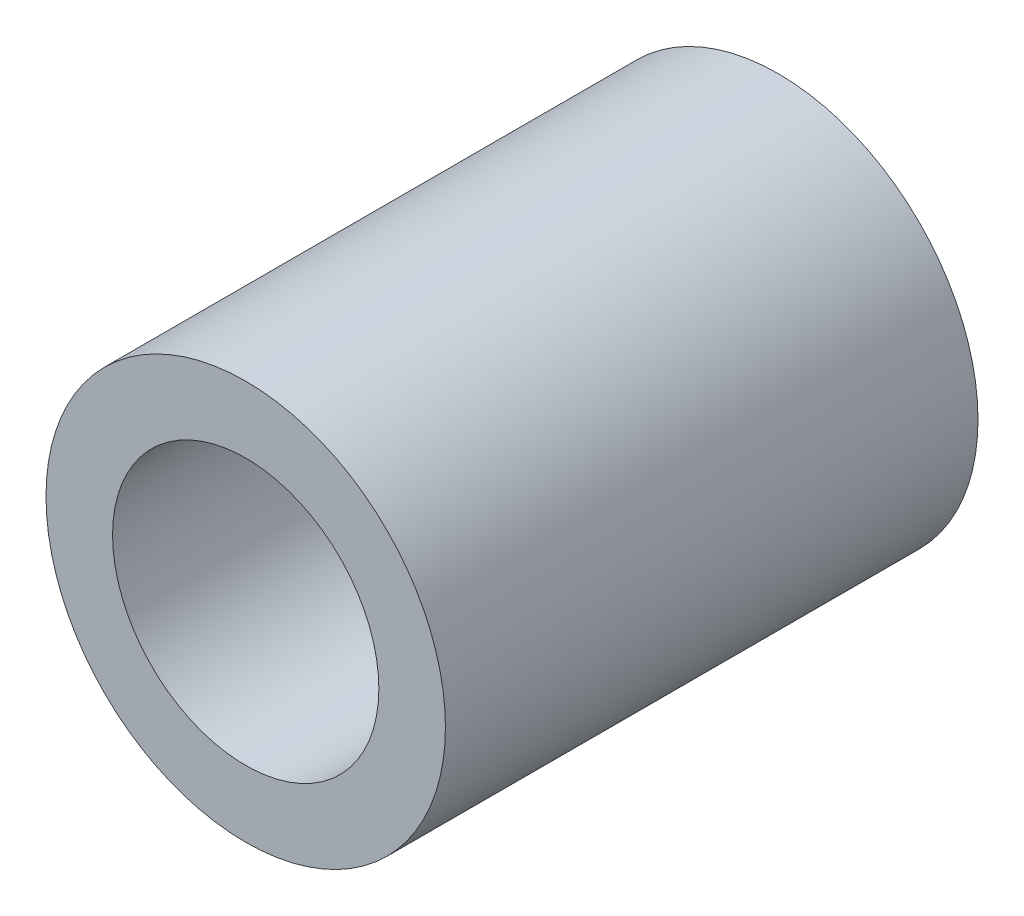
ISO-10303-21;
HEADER;
FILE_DESCRIPTION(('STEP AP214'),'2;1');
FILE_NAME('part.step','',(''),(''),'','','');
FILE_SCHEMA(('AUTOMOTIVE_DESIGN { 1 0 10303 214 1 1 1 1 }'));
ENDSEC;
DATA;
#1=APPLICATION_CONTEXT('core data for automotive mechanical design processes');
#2=APPLICATION_PROTOCOL_DEFINITION('international standard','automotive_design',2000,#1);
#3=PRODUCT_CONTEXT('',#1,'mechanical');
#4=PRODUCT('Part','Part','',(#3));
#5=PRODUCT_RELATED_PRODUCT_CATEGORY('part','',(#4));
#6=PRODUCT_DEFINITION_FORMATION('','',#4);
#7=PRODUCT_DEFINITION_CONTEXT('part definition',#1,'design');
#8=PRODUCT_DEFINITION('design','',#6,#7);
#9=PRODUCT_DEFINITION_SHAPE('','',#8);
#10=(LENGTH_UNIT() NAMED_UNIT(*) SI_UNIT(.MILLI.,.METRE.));
#11=(NAMED_UNIT(*) PLANE_ANGLE_UNIT() SI_UNIT($,.RADIAN.));
#12=(NAMED_UNIT(*) SI_UNIT($,.STERADIAN.) SOLID_ANGLE_UNIT());
#13=UNCERTAINTY_MEASURE_WITH_UNIT(LENGTH_MEASURE(1.E-05),#10,'distance_accuracy_value','');
#14=(GEOMETRIC_REPRESENTATION_CONTEXT(3) GLOBAL_UNCERTAINTY_ASSIGNED_CONTEXT((#13)) GLOBAL_UNIT_ASSIGNED_CONTEXT((#10,
#11,#12)) REPRESENTATION_CONTEXT('',''));
#15=CARTESIAN_POINT('',(0.,0.,0.));
#16=DIRECTION('',(0.,0.,1.));
#17=DIRECTION('',(1.,0.,0.));
#18=AXIS2_PLACEMENT_3D('',#15,#16,#17);
#19=CARTESIAN_POINT('',(0.,0.,50.8));
#20=DIRECTION('',(0.,0.,-1.));
#21=DIRECTION('',(-1.,0.,0.));
#22=AXIS2_PLACEMENT_3D('',#19,#20,#21);
#23=CYLINDRICAL_SURFACE('',#22,19.05);
#24=CARTESIAN_POINT('',(0.,0.,50.8));
#25=DIRECTION('',(0.,0.,1.));
#26=DIRECTION('',(1.,0.,0.));
#27=AXIS2_PLACEMENT_3D('',#24,#25,#26);
#28=CIRCLE('',#27,19.05);
#29=CARTESIAN_POINT('',(19.05,0.,50.8));
#30=VERTEX_POINT('',#29);
#31=EDGE_CURVE('E10',#30,#30,#28,.T.);
#32=ORIENTED_EDGE('',*,*,#31,.F.);
#33=EDGE_LOOP('',(#32));
#34=FACE_BOUND('',#33,.T.);
#35=CARTESIAN_POINT('',(0.,0.,0.));
#36=DIRECTION('',(0.,0.,1.));
#37=DIRECTION('',(1.,0.,0.));
#38=AXIS2_PLACEMENT_3D('',#35,#36,#37);
#39=CIRCLE('',#38,19.05);
#40=CARTESIAN_POINT('',(19.05,0.,0.));
#41=VERTEX_POINT('',#40);
#42=EDGE_CURVE('E40',#41,#41,#39,.T.);
#43=ORIENTED_EDGE('',*,*,#42,.T.);
#44=EDGE_LOOP('',(#43));
#45=FACE_BOUND('',#44,.T.);
#46=ADVANCED_FACE('F37',(#34,#45),#23,.T.);
#47=CARTESIAN_POINT('',(0.,0.,50.8));
#48=DIRECTION('',(0.,0.,1.));
#49=DIRECTION('',(1.,0.,0.));
#50=AXIS2_PLACEMENT_3D('',#47,#48,#49);
#51=PLANE('',#50);
#52=CARTESIAN_POINT('',(0.,0.,50.8));
#53=DIRECTION('',(0.,0.,1.));
#54=DIRECTION('',(1.,0.,0.));
#55=AXIS2_PLACEMENT_3D('',#52,#53,#54);
#56=CIRCLE('',#55,12.7);
#57=CARTESIAN_POINT('',(12.7,0.,50.8));
#58=VERTEX_POINT('',#57);
#59=EDGE_CURVE('E51',#58,#58,#56,.T.);
#60=ORIENTED_EDGE('',*,*,#59,.F.);
#61=EDGE_LOOP('',(#60));
#62=FACE_BOUND('',#61,.T.);
#63=ORIENTED_EDGE('',*,*,#31,.T.);
#64=EDGE_LOOP('',(#63));
#65=FACE_BOUND('',#64,.T.);
#66=ADVANCED_FACE('F80',(#62,#65),#51,.T.);
#67=CARTESIAN_POINT('',(0.,0.,0.));
#68=DIRECTION('',(0.,0.,1.));
#69=DIRECTION('',(1.,0.,0.));
#70=AXIS2_PLACEMENT_3D('',#67,#68,#69);
#71=PLANE('',#70);
#72=CARTESIAN_POINT('',(0.,0.,0.));
#73=DIRECTION('',(0.,0.,-1.));
#74=DIRECTION('',(-1.,0.,0.));
#75=AXIS2_PLACEMENT_3D('',#72,#73,#74);
#76=CIRCLE('',#75,6.35);
#77=CARTESIAN_POINT('',(-6.35,0.,0.));
#78=VERTEX_POINT('',#77);
#79=EDGE_CURVE('E59',#78,#78,#76,.T.);
#80=ORIENTED_EDGE('',*,*,#79,.F.);
#81=EDGE_LOOP('',(#80));
#82=FACE_BOUND('',#81,.T.);
#83=ORIENTED_EDGE('',*,*,#42,.F.);
#84=EDGE_LOOP('',(#83));
#85=FACE_BOUND('',#84,.T.);
#86=ADVANCED_FACE('F76',(#82,#85),#71,.F.);
#87=CARTESIAN_POINT('',(0.,0.,7.35));
#88=DIRECTION('',(0.,0.,1.));
#89=DIRECTION('',(1.,0.,0.));
#90=AXIS2_PLACEMENT_3D('',#87,#88,#89);
#91=CYLINDRICAL_SURFACE('',#90,12.7);
#92=CARTESIAN_POINT('',(0.,0.,7.35));
#93=DIRECTION('',(0.,0.,1.));
#94=DIRECTION('',(1.,0.,0.));
#95=AXIS2_PLACEMENT_3D('',#92,#93,#94);
#96=CIRCLE('',#95,12.7);
#97=CARTESIAN_POINT('',(12.7,0.,7.35));
#98=VERTEX_POINT('',#97);
#99=EDGE_CURVE('E49',#98,#98,#96,.T.);
#100=ORIENTED_EDGE('',*,*,#99,.F.);
#101=EDGE_LOOP('',(#100));
#102=FACE_BOUND('',#101,.T.);
#103=ORIENTED_EDGE('',*,*,#59,.T.);
#104=EDGE_LOOP('',(#103));
#105=FACE_BOUND('',#104,.T.);
#106=ADVANCED_FACE('F79',(#102,#105),#91,.F.);
#107=CARTESIAN_POINT('',(0.,0.,7.35));
#108=DIRECTION('',(0.,0.,1.));
#109=DIRECTION('',(1.,0.,0.));
#110=AXIS2_PLACEMENT_3D('',#107,#108,#109);
#111=PLANE('',#110);
#112=CARTESIAN_POINT('',(0.,0.,7.35));
#113=DIRECTION('',(0.,0.,-1.));
#114=DIRECTION('',(-1.,0.,0.));
#115=AXIS2_PLACEMENT_3D('',#112,#113,#114);
#116=CIRCLE('',#115,6.35);
#117=CARTESIAN_POINT('',(-6.35,0.,7.35));
#118=VERTEX_POINT('',#117);
#119=EDGE_CURVE('E55',#118,#118,#116,.T.);
#120=ORIENTED_EDGE('',*,*,#119,.T.);
#121=EDGE_LOOP('',(#120));
#122=FACE_BOUND('',#121,.T.);
#123=ORIENTED_EDGE('',*,*,#99,.T.);
#124=EDGE_LOOP('',(#123));
#125=FACE_BOUND('',#124,.T.);
#126=ADVANCED_FACE('F67',(#122,#125),#111,.T.);
#127=CARTESIAN_POINT('',(0.,0.,7.35));
#128=DIRECTION('',(0.,0.,-1.));
#129=DIRECTION('',(-1.,0.,0.));
#130=AXIS2_PLACEMENT_3D('',#127,#128,#129);
#131=CYLINDRICAL_SURFACE('',#130,6.35);
#132=ORIENTED_EDGE('',*,*,#119,.F.);
#133=EDGE_LOOP('',(#132));
#134=FACE_BOUND('',#133,.T.);
#135=ORIENTED_EDGE('',*,*,#79,.T.);
#136=EDGE_LOOP('',(#135));
#137=FACE_BOUND('',#136,.T.);
#138=ADVANCED_FACE('F70',(#134,#137),#131,.F.);
#139=CLOSED_SHELL('',(#46,#66,#86,#106,#126,#138));
#140=MANIFOLD_SOLID_BREP('B2',#139);
#141=ADVANCED_BREP_SHAPE_REPRESENTATION('',(#18,#140),#14);
#142=SHAPE_DEFINITION_REPRESENTATION(#9,#141);
ENDSEC;
END-ISO-10303-21;
